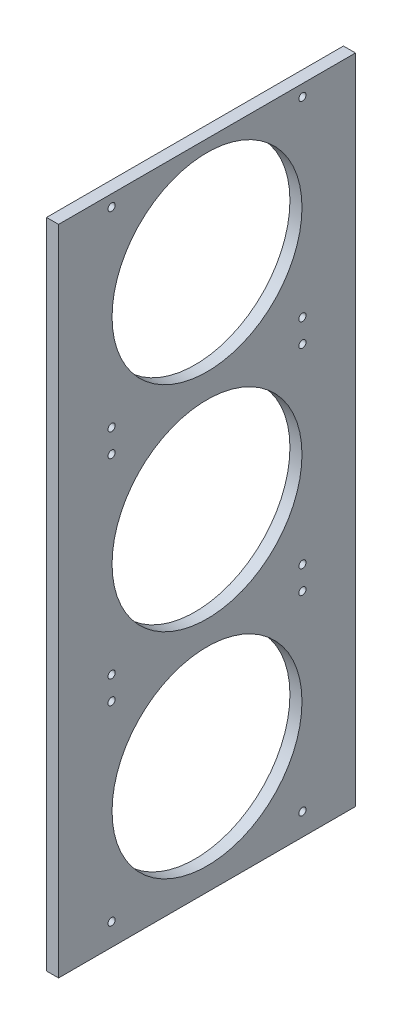
ISO-10303-21;
HEADER;
FILE_DESCRIPTION(('STEP AP214'),'2;1');
FILE_NAME('part.step','',(''),(''),'','','');
FILE_SCHEMA(('AUTOMOTIVE_DESIGN { 1 0 10303 214 1 1 1 1 }'));
ENDSEC;
DATA;
#1=APPLICATION_CONTEXT('core data for automotive mechanical design processes');
#2=APPLICATION_PROTOCOL_DEFINITION('international standard','automotive_design',2000,#1);
#3=PRODUCT_CONTEXT('',#1,'mechanical');
#4=PRODUCT('Part','Part','',(#3));
#5=PRODUCT_RELATED_PRODUCT_CATEGORY('part','',(#4));
#6=PRODUCT_DEFINITION_FORMATION('','',#4);
#7=PRODUCT_DEFINITION_CONTEXT('part definition',#1,'design');
#8=PRODUCT_DEFINITION('design','',#6,#7);
#9=PRODUCT_DEFINITION_SHAPE('','',#8);
#10=(LENGTH_UNIT() NAMED_UNIT(*) SI_UNIT(.MILLI.,.METRE.));
#11=(NAMED_UNIT(*) PLANE_ANGLE_UNIT() SI_UNIT($,.RADIAN.));
#12=(NAMED_UNIT(*) SI_UNIT($,.STERADIAN.) SOLID_ANGLE_UNIT());
#13=UNCERTAINTY_MEASURE_WITH_UNIT(LENGTH_MEASURE(1.E-05),#10,'distance_accuracy_value','');
#14=(GEOMETRIC_REPRESENTATION_CONTEXT(3) GLOBAL_UNCERTAINTY_ASSIGNED_CONTEXT((#13)) GLOBAL_UNIT_ASSIGNED_CONTEXT((#10,
#11,#12)) REPRESENTATION_CONTEXT('',''));
#15=CARTESIAN_POINT('',(0.,0.,0.));
#16=DIRECTION('',(0.,0.,1.));
#17=DIRECTION('',(1.,0.,0.));
#18=AXIS2_PLACEMENT_3D('',#15,#16,#17);
#19=CARTESIAN_POINT('',(-83.25,91.5,-55.5));
#20=DIRECTION('',(0.,0.,1.));
#21=DIRECTION('',(1.,0.,0.));
#22=AXIS2_PLACEMENT_3D('',#19,#20,#21);
#23=PLANE('',#22);
#24=DIRECTION('',(0.,1.,0.));
#25=VECTOR('',#24,1.);
#26=CARTESIAN_POINT('',(78.75,0.,-55.5));
#27=LINE('',#26,#25);
#28=CARTESIAN_POINT('',(78.75,0.,-55.5));
#29=VERTEX_POINT('',#28);
#30=CARTESIAN_POINT('',(78.75,244.,-55.5));
#31=VERTEX_POINT('',#30);
#32=EDGE_CURVE('E87',#29,#31,#27,.T.);
#33=ORIENTED_EDGE('',*,*,#32,.T.);
#34=DIRECTION('',(-1.,0.,0.));
#35=VECTOR('',#34,1.);
#36=CARTESIAN_POINT('',(-83.25,244.,-55.5));
#37=LINE('',#36,#35);
#38=CARTESIAN_POINT('',(83.25,244.,-55.5));
#39=VERTEX_POINT('',#38);
#40=EDGE_CURVE('E111',#39,#31,#37,.T.);
#41=ORIENTED_EDGE('',*,*,#40,.F.);
#42=DIRECTION('',(0.,-1.,0.));
#43=VECTOR('',#42,1.);
#44=CARTESIAN_POINT('',(83.25,91.5,-55.5));
#45=LINE('',#44,#43);
#46=CARTESIAN_POINT('',(83.25,0.,-55.5));
#47=VERTEX_POINT('',#46);
#48=EDGE_CURVE('E11',#39,#47,#45,.T.);
#49=ORIENTED_EDGE('',*,*,#48,.T.);
#50=DIRECTION('',(-1.,0.,0.));
#51=VECTOR('',#50,1.);
#52=CARTESIAN_POINT('',(-83.25,0.,-55.5));
#53=LINE('',#52,#51);
#54=EDGE_CURVE('E103',#47,#29,#53,.T.);
#55=ORIENTED_EDGE('',*,*,#54,.T.);
#56=EDGE_LOOP('',(#33,#41,#49,#55));
#57=FACE_BOUND('',#56,.T.);
#58=ADVANCED_FACE('F40',(#57),#23,.F.);
#59=CARTESIAN_POINT('',(-83.25,91.5,55.5));
#60=DIRECTION('',(0.,0.,-1.));
#61=DIRECTION('',(-1.,0.,0.));
#62=AXIS2_PLACEMENT_3D('',#59,#60,#61);
#63=PLANE('',#62);
#64=DIRECTION('',(0.,-1.,0.));
#65=VECTOR('',#64,1.);
#66=CARTESIAN_POINT('',(78.75,0.,55.5));
#67=LINE('',#66,#65);
#68=CARTESIAN_POINT('',(78.75,244.,55.5));
#69=VERTEX_POINT('',#68);
#70=CARTESIAN_POINT('',(78.75,0.,55.5));
#71=VERTEX_POINT('',#70);
#72=EDGE_CURVE('E85',#69,#71,#67,.T.);
#73=ORIENTED_EDGE('',*,*,#72,.T.);
#74=DIRECTION('',(1.,0.,0.));
#75=VECTOR('',#74,1.);
#76=CARTESIAN_POINT('',(-83.25,0.,55.5));
#77=LINE('',#76,#75);
#78=CARTESIAN_POINT('',(83.25,0.,55.5));
#79=VERTEX_POINT('',#78);
#80=EDGE_CURVE('E97',#71,#79,#77,.T.);
#81=ORIENTED_EDGE('',*,*,#80,.T.);
#82=DIRECTION('',(0.,-1.,0.));
#83=VECTOR('',#82,1.);
#84=CARTESIAN_POINT('',(83.25,91.5,55.5));
#85=LINE('',#84,#83);
#86=CARTESIAN_POINT('',(83.25,244.,55.5));
#87=VERTEX_POINT('',#86);
#88=EDGE_CURVE('E48',#87,#79,#85,.T.);
#89=ORIENTED_EDGE('',*,*,#88,.F.);
#90=DIRECTION('',(1.,0.,0.));
#91=VECTOR('',#90,1.);
#92=CARTESIAN_POINT('',(-83.25,244.,55.5));
#93=LINE('',#92,#91);
#94=EDGE_CURVE('E55',#69,#87,#93,.T.);
#95=ORIENTED_EDGE('',*,*,#94,.F.);
#96=EDGE_LOOP('',(#73,#81,#89,#95));
#97=FACE_BOUND('',#96,.T.);
#98=ADVANCED_FACE('F96',(#97),#63,.F.);
#99=CARTESIAN_POINT('',(0.,244.,0.));
#100=DIRECTION('',(0.,1.,0.));
#101=DIRECTION('',(0.,0.,1.));
#102=AXIS2_PLACEMENT_3D('',#99,#100,#101);
#103=PLANE('',#102);
#104=ORIENTED_EDGE('',*,*,#40,.T.);
#105=DIRECTION('',(0.,0.,-1.));
#106=VECTOR('',#105,1.);
#107=CARTESIAN_POINT('',(78.75,244.,-55.5));
#108=LINE('',#107,#106);
#109=EDGE_CURVE('E102',#69,#31,#108,.T.);
#110=ORIENTED_EDGE('',*,*,#109,.F.);
#111=ORIENTED_EDGE('',*,*,#94,.T.);
#112=DIRECTION('',(0.,0.,-1.));
#113=VECTOR('',#112,1.);
#114=CARTESIAN_POINT('',(83.25,244.,-55.5));
#115=LINE('',#114,#113);
#116=EDGE_CURVE('E105',#87,#39,#115,.T.);
#117=ORIENTED_EDGE('',*,*,#116,.T.);
#118=EDGE_LOOP('',(#104,#110,#111,#117));
#119=FACE_BOUND('',#118,.T.);
#120=ADVANCED_FACE('F115',(#119),#103,.T.);
#121=CARTESIAN_POINT('',(0.,0.,0.));
#122=DIRECTION('',(0.,1.,0.));
#123=DIRECTION('',(0.,0.,1.));
#124=AXIS2_PLACEMENT_3D('',#121,#122,#123);
#125=PLANE('',#124);
#126=DIRECTION('',(0.,0.,1.));
#127=VECTOR('',#126,1.);
#128=CARTESIAN_POINT('',(78.75,0.,-46.));
#129=LINE('',#128,#127);
#130=EDGE_CURVE('E81',#29,#71,#129,.T.);
#131=ORIENTED_EDGE('',*,*,#130,.F.);
#132=ORIENTED_EDGE('',*,*,#54,.F.);
#133=DIRECTION('',(0.,0.,-1.));
#134=VECTOR('',#133,1.);
#135=CARTESIAN_POINT('',(83.25,0.,-55.5));
#136=LINE('',#135,#134);
#137=EDGE_CURVE('E92',#79,#47,#136,.T.);
#138=ORIENTED_EDGE('',*,*,#137,.F.);
#139=ORIENTED_EDGE('',*,*,#80,.F.);
#140=EDGE_LOOP('',(#131,#132,#138,#139));
#141=FACE_BOUND('',#140,.T.);
#142=ADVANCED_FACE('F101',(#141),#125,.F.);
#143=CARTESIAN_POINT('',(83.25,91.5,-55.5));
#144=DIRECTION('',(-1.,0.,0.));
#145=DIRECTION('',(0.,0.,1.));
#146=AXIS2_PLACEMENT_3D('',#143,#144,#145);
#147=PLANE('',#146);
#148=CARTESIAN_POINT('',(83.25,79.675,-35.675));
#149=DIRECTION('',(1.,0.,0.));
#150=DIRECTION('',(0.,0.,-1.));
#151=AXIS2_PLACEMENT_3D('',#148,#149,#150);
#152=CIRCLE('',#151,1.35254999999999);
#153=CARTESIAN_POINT('',(83.25,79.675,-37.02755));
#154=VERTEX_POINT('',#153);
#155=EDGE_CURVE('E131',#154,#154,#152,.T.);
#156=ORIENTED_EDGE('',*,*,#155,.F.);
#157=EDGE_LOOP('',(#156));
#158=FACE_BOUND('',#157,.T.);
#159=CARTESIAN_POINT('',(83.25,88.325,35.675));
#160=DIRECTION('',(1.,0.,0.));
#161=DIRECTION('',(0.,0.,-1.));
#162=AXIS2_PLACEMENT_3D('',#159,#160,#161);
#163=CIRCLE('',#162,1.35254999999999);
#164=CARTESIAN_POINT('',(83.25,88.325,34.32245));
#165=VERTEX_POINT('',#164);
#166=EDGE_CURVE('E143',#165,#165,#163,.T.);
#167=ORIENTED_EDGE('',*,*,#166,.F.);
#168=EDGE_LOOP('',(#167));
#169=FACE_BOUND('',#168,.T.);
#170=CARTESIAN_POINT('',(83.25,159.675,-35.675));
#171=DIRECTION('',(1.,0.,0.));
#172=DIRECTION('',(0.,0.,-1.));
#173=AXIS2_PLACEMENT_3D('',#170,#171,#172);
#174=CIRCLE('',#173,1.35255000000001);
#175=CARTESIAN_POINT('',(83.25,159.675,-37.02755));
#176=VERTEX_POINT('',#175);
#177=EDGE_CURVE('E155',#176,#176,#174,.T.);
#178=ORIENTED_EDGE('',*,*,#177,.F.);
#179=EDGE_LOOP('',(#178));
#180=FACE_BOUND('',#179,.T.);
#181=CARTESIAN_POINT('',(83.25,239.675,-35.675));
#182=DIRECTION('',(1.,0.,0.));
#183=DIRECTION('',(0.,0.,-1.));
#184=AXIS2_PLACEMENT_3D('',#181,#182,#183);
#185=CIRCLE('',#184,1.35255000000001);
#186=CARTESIAN_POINT('',(83.25,239.675,-37.02755));
#187=VERTEX_POINT('',#186);
#188=EDGE_CURVE('E173',#187,#187,#185,.T.);
#189=ORIENTED_EDGE('',*,*,#188,.F.);
#190=EDGE_LOOP('',(#189));
#191=FACE_BOUND('',#190,.T.);
#192=CARTESIAN_POINT('',(83.25,168.325,-35.675));
#193=DIRECTION('',(1.,0.,0.));
#194=DIRECTION('',(0.,0.,-1.));
#195=AXIS2_PLACEMENT_3D('',#192,#193,#194);
#196=CIRCLE('',#195,1.35255000000001);
#197=CARTESIAN_POINT('',(83.25,168.325,-37.02755));
#198=VERTEX_POINT('',#197);
#199=EDGE_CURVE('E179',#198,#198,#196,.T.);
#200=ORIENTED_EDGE('',*,*,#199,.F.);
#201=EDGE_LOOP('',(#200));
#202=FACE_BOUND('',#201,.T.);
#203=CARTESIAN_POINT('',(83.25,168.325,35.675));
#204=DIRECTION('',(1.,0.,0.));
#205=DIRECTION('',(0.,0.,-1.));
#206=AXIS2_PLACEMENT_3D('',#203,#204,#205);
#207=CIRCLE('',#206,1.35255000000001);
#208=CARTESIAN_POINT('',(83.25,168.325,34.32245));
#209=VERTEX_POINT('',#208);
#210=EDGE_CURVE('E185',#209,#209,#207,.T.);
#211=ORIENTED_EDGE('',*,*,#210,.F.);
#212=EDGE_LOOP('',(#211));
#213=FACE_BOUND('',#212,.T.);
#214=CARTESIAN_POINT('',(83.25,204.,0.));
#215=DIRECTION('',(1.,0.,0.));
#216=DIRECTION('',(0.,0.,-1.));
#217=AXIS2_PLACEMENT_3D('',#214,#215,#216);
#218=CIRCLE('',#217,35.5);
#219=CARTESIAN_POINT('',(83.25,204.,-35.5));
#220=VERTEX_POINT('',#219);
#221=EDGE_CURVE('E93',#220,#220,#218,.T.);
#222=ORIENTED_EDGE('',*,*,#221,.F.);
#223=EDGE_LOOP('',(#222));
#224=FACE_BOUND('',#223,.T.);
#225=CARTESIAN_POINT('',(83.25,124.,0.));
#226=DIRECTION('',(1.,0.,0.));
#227=DIRECTION('',(0.,0.,-1.));
#228=AXIS2_PLACEMENT_3D('',#225,#226,#227);
#229=CIRCLE('',#228,35.5);
#230=CARTESIAN_POINT('',(83.25,124.,-35.5));
#231=VERTEX_POINT('',#230);
#232=EDGE_CURVE('E197',#231,#231,#229,.T.);
#233=ORIENTED_EDGE('',*,*,#232,.F.);
#234=EDGE_LOOP('',(#233));
#235=FACE_BOUND('',#234,.T.);
#236=CARTESIAN_POINT('',(83.25,44.,0.));
#237=DIRECTION('',(1.,0.,0.));
#238=DIRECTION('',(0.,0.,-1.));
#239=AXIS2_PLACEMENT_3D('',#236,#237,#238);
#240=CIRCLE('',#239,35.5);
#241=CARTESIAN_POINT('',(83.25,44.,-35.5000000000001));
#242=VERTEX_POINT('',#241);
#243=EDGE_CURVE('E203',#242,#242,#240,.T.);
#244=ORIENTED_EDGE('',*,*,#243,.F.);
#245=EDGE_LOOP('',(#244));
#246=FACE_BOUND('',#245,.T.);
#247=ORIENTED_EDGE('',*,*,#88,.T.);
#248=ORIENTED_EDGE('',*,*,#137,.T.);
#249=ORIENTED_EDGE('',*,*,#48,.F.);
#250=ORIENTED_EDGE('',*,*,#116,.F.);
#251=EDGE_LOOP('',(#247,#248,#249,#250));
#252=FACE_BOUND('',#251,.T.);
#253=CARTESIAN_POINT('',(83.25,239.675,35.675));
#254=DIRECTION('',(1.,0.,0.));
#255=DIRECTION('',(0.,0.,-1.));
#256=AXIS2_PLACEMENT_3D('',#253,#254,#255);
#257=CIRCLE('',#256,1.35255000000001);
#258=CARTESIAN_POINT('',(83.25,239.675,34.32245));
#259=VERTEX_POINT('',#258);
#260=EDGE_CURVE('E167',#259,#259,#257,.T.);
#261=ORIENTED_EDGE('',*,*,#260,.F.);
#262=EDGE_LOOP('',(#261));
#263=FACE_BOUND('',#262,.T.);
#264=CARTESIAN_POINT('',(83.25,159.675,35.675));
#265=DIRECTION('',(1.,0.,0.));
#266=DIRECTION('',(0.,0.,-1.));
#267=AXIS2_PLACEMENT_3D('',#264,#265,#266);
#268=CIRCLE('',#267,1.35255000000001);
#269=CARTESIAN_POINT('',(83.25,159.675,34.32245));
#270=VERTEX_POINT('',#269);
#271=EDGE_CURVE('E161',#270,#270,#268,.T.);
#272=ORIENTED_EDGE('',*,*,#271,.F.);
#273=EDGE_LOOP('',(#272));
#274=FACE_BOUND('',#273,.T.);
#275=CARTESIAN_POINT('',(83.25,88.325,-35.675));
#276=DIRECTION('',(1.,0.,0.));
#277=DIRECTION('',(0.,0.,-1.));
#278=AXIS2_PLACEMENT_3D('',#275,#276,#277);
#279=CIRCLE('',#278,1.35254999999999);
#280=CARTESIAN_POINT('',(83.25,88.325,-37.02755));
#281=VERTEX_POINT('',#280);
#282=EDGE_CURVE('E149',#281,#281,#279,.T.);
#283=ORIENTED_EDGE('',*,*,#282,.F.);
#284=EDGE_LOOP('',(#283));
#285=FACE_BOUND('',#284,.T.);
#286=CARTESIAN_POINT('',(83.25,79.675,35.675));
#287=DIRECTION('',(1.,0.,0.));
#288=DIRECTION('',(0.,0.,-1.));
#289=AXIS2_PLACEMENT_3D('',#286,#287,#288);
#290=CIRCLE('',#289,1.35254999999999);
#291=CARTESIAN_POINT('',(83.25,79.675,34.32245));
#292=VERTEX_POINT('',#291);
#293=EDGE_CURVE('E137',#292,#292,#290,.T.);
#294=ORIENTED_EDGE('',*,*,#293,.F.);
#295=EDGE_LOOP('',(#294));
#296=FACE_BOUND('',#295,.T.);
#297=CARTESIAN_POINT('',(83.25,8.325,-35.675));
#298=DIRECTION('',(1.,0.,0.));
#299=DIRECTION('',(0.,0.,-1.));
#300=AXIS2_PLACEMENT_3D('',#297,#298,#299);
#301=CIRCLE('',#300,1.35255);
#302=CARTESIAN_POINT('',(83.25,8.325,-37.02755));
#303=VERTEX_POINT('',#302);
#304=EDGE_CURVE('E125',#303,#303,#301,.T.);
#305=ORIENTED_EDGE('',*,*,#304,.F.);
#306=EDGE_LOOP('',(#305));
#307=FACE_BOUND('',#306,.T.);
#308=CARTESIAN_POINT('',(83.25,8.325,35.675));
#309=DIRECTION('',(1.,0.,0.));
#310=DIRECTION('',(0.,0.,-1.));
#311=AXIS2_PLACEMENT_3D('',#308,#309,#310);
#312=CIRCLE('',#311,1.35255);
#313=CARTESIAN_POINT('',(83.25,8.325,34.32245));
#314=VERTEX_POINT('',#313);
#315=EDGE_CURVE('E117',#314,#314,#312,.T.);
#316=ORIENTED_EDGE('',*,*,#315,.F.);
#317=EDGE_LOOP('',(#316));
#318=FACE_BOUND('',#317,.T.);
#319=ADVANCED_FACE('F42',(#158,#169,#180,#191,#202,#213,#224,#235,#246,#252,#263,#274,#285,#296,
#307,#318),#147,.F.);
#320=CARTESIAN_POINT('',(78.75,91.5,-55.5));
#321=DIRECTION('',(-1.,0.,0.));
#322=DIRECTION('',(0.,0.,1.));
#323=AXIS2_PLACEMENT_3D('',#320,#321,#322);
#324=PLANE('',#323);
#325=ORIENTED_EDGE('',*,*,#109,.T.);
#326=ORIENTED_EDGE('',*,*,#32,.F.);
#327=ORIENTED_EDGE('',*,*,#130,.T.);
#328=ORIENTED_EDGE('',*,*,#72,.F.);
#329=EDGE_LOOP('',(#325,#326,#327,#328));
#330=FACE_BOUND('',#329,.T.);
#331=CARTESIAN_POINT('',(78.75,8.325,35.675));
#332=DIRECTION('',(-1.,0.,0.));
#333=DIRECTION('',(0.,0.,1.));
#334=AXIS2_PLACEMENT_3D('',#331,#332,#333);
#335=CIRCLE('',#334,1.35255);
#336=CARTESIAN_POINT('',(78.75,8.325,37.02755));
#337=VERTEX_POINT('',#336);
#338=EDGE_CURVE('E120',#337,#337,#335,.T.);
#339=ORIENTED_EDGE('',*,*,#338,.F.);
#340=EDGE_LOOP('',(#339));
#341=FACE_BOUND('',#340,.T.);
#342=CARTESIAN_POINT('',(78.75,8.325,-35.675));
#343=DIRECTION('',(-1.,0.,0.));
#344=DIRECTION('',(0.,0.,1.));
#345=AXIS2_PLACEMENT_3D('',#342,#343,#344);
#346=CIRCLE('',#345,1.35255);
#347=CARTESIAN_POINT('',(78.75,8.325,-34.32245));
#348=VERTEX_POINT('',#347);
#349=EDGE_CURVE('E128',#348,#348,#346,.T.);
#350=ORIENTED_EDGE('',*,*,#349,.F.);
#351=EDGE_LOOP('',(#350));
#352=FACE_BOUND('',#351,.T.);
#353=CARTESIAN_POINT('',(78.75,79.675,-35.675));
#354=DIRECTION('',(-1.,0.,0.));
#355=DIRECTION('',(0.,0.,1.));
#356=AXIS2_PLACEMENT_3D('',#353,#354,#355);
#357=CIRCLE('',#356,1.35254999999999);
#358=CARTESIAN_POINT('',(78.75,79.675,-34.32245));
#359=VERTEX_POINT('',#358);
#360=EDGE_CURVE('E134',#359,#359,#357,.T.);
#361=ORIENTED_EDGE('',*,*,#360,.F.);
#362=EDGE_LOOP('',(#361));
#363=FACE_BOUND('',#362,.T.);
#364=CARTESIAN_POINT('',(78.75,79.675,35.675));
#365=DIRECTION('',(-1.,0.,0.));
#366=DIRECTION('',(0.,0.,1.));
#367=AXIS2_PLACEMENT_3D('',#364,#365,#366);
#368=CIRCLE('',#367,1.35254999999999);
#369=CARTESIAN_POINT('',(78.75,79.675,37.02755));
#370=VERTEX_POINT('',#369);
#371=EDGE_CURVE('E140',#370,#370,#368,.T.);
#372=ORIENTED_EDGE('',*,*,#371,.F.);
#373=EDGE_LOOP('',(#372));
#374=FACE_BOUND('',#373,.T.);
#375=CARTESIAN_POINT('',(78.75,88.325,35.675));
#376=DIRECTION('',(-1.,0.,0.));
#377=DIRECTION('',(0.,0.,1.));
#378=AXIS2_PLACEMENT_3D('',#375,#376,#377);
#379=CIRCLE('',#378,1.35254999999999);
#380=CARTESIAN_POINT('',(78.75,88.325,37.02755));
#381=VERTEX_POINT('',#380);
#382=EDGE_CURVE('E146',#381,#381,#379,.T.);
#383=ORIENTED_EDGE('',*,*,#382,.F.);
#384=EDGE_LOOP('',(#383));
#385=FACE_BOUND('',#384,.T.);
#386=CARTESIAN_POINT('',(78.75,88.325,-35.675));
#387=DIRECTION('',(-1.,0.,0.));
#388=DIRECTION('',(0.,0.,1.));
#389=AXIS2_PLACEMENT_3D('',#386,#387,#388);
#390=CIRCLE('',#389,1.35254999999999);
#391=CARTESIAN_POINT('',(78.75,88.325,-34.32245));
#392=VERTEX_POINT('',#391);
#393=EDGE_CURVE('E152',#392,#392,#390,.T.);
#394=ORIENTED_EDGE('',*,*,#393,.F.);
#395=EDGE_LOOP('',(#394));
#396=FACE_BOUND('',#395,.T.);
#397=CARTESIAN_POINT('',(78.75,159.675,-35.675));
#398=DIRECTION('',(-1.,0.,0.));
#399=DIRECTION('',(0.,0.,1.));
#400=AXIS2_PLACEMENT_3D('',#397,#398,#399);
#401=CIRCLE('',#400,1.35255000000001);
#402=CARTESIAN_POINT('',(78.75,159.675,-34.32245));
#403=VERTEX_POINT('',#402);
#404=EDGE_CURVE('E158',#403,#403,#401,.T.);
#405=ORIENTED_EDGE('',*,*,#404,.F.);
#406=EDGE_LOOP('',(#405));
#407=FACE_BOUND('',#406,.T.);
#408=CARTESIAN_POINT('',(78.75,159.675,35.675));
#409=DIRECTION('',(-1.,0.,0.));
#410=DIRECTION('',(0.,0.,1.));
#411=AXIS2_PLACEMENT_3D('',#408,#409,#410);
#412=CIRCLE('',#411,1.35255000000001);
#413=CARTESIAN_POINT('',(78.75,159.675,37.02755));
#414=VERTEX_POINT('',#413);
#415=EDGE_CURVE('E164',#414,#414,#412,.T.);
#416=ORIENTED_EDGE('',*,*,#415,.F.);
#417=EDGE_LOOP('',(#416));
#418=FACE_BOUND('',#417,.T.);
#419=CARTESIAN_POINT('',(78.75,239.675,35.675));
#420=DIRECTION('',(-1.,0.,0.));
#421=DIRECTION('',(0.,0.,1.));
#422=AXIS2_PLACEMENT_3D('',#419,#420,#421);
#423=CIRCLE('',#422,1.35255000000001);
#424=CARTESIAN_POINT('',(78.75,239.675,37.02755));
#425=VERTEX_POINT('',#424);
#426=EDGE_CURVE('E170',#425,#425,#423,.T.);
#427=ORIENTED_EDGE('',*,*,#426,.F.);
#428=EDGE_LOOP('',(#427));
#429=FACE_BOUND('',#428,.T.);
#430=CARTESIAN_POINT('',(78.75,239.675,-35.675));
#431=DIRECTION('',(-1.,0.,0.));
#432=DIRECTION('',(0.,0.,1.));
#433=AXIS2_PLACEMENT_3D('',#430,#431,#432);
#434=CIRCLE('',#433,1.35255000000001);
#435=CARTESIAN_POINT('',(78.75,239.675,-34.32245));
#436=VERTEX_POINT('',#435);
#437=EDGE_CURVE('E176',#436,#436,#434,.T.);
#438=ORIENTED_EDGE('',*,*,#437,.F.);
#439=EDGE_LOOP('',(#438));
#440=FACE_BOUND('',#439,.T.);
#441=CARTESIAN_POINT('',(78.75,168.325,-35.675));
#442=DIRECTION('',(-1.,0.,0.));
#443=DIRECTION('',(0.,0.,1.));
#444=AXIS2_PLACEMENT_3D('',#441,#442,#443);
#445=CIRCLE('',#444,1.35255000000001);
#446=CARTESIAN_POINT('',(78.75,168.325,-34.32245));
#447=VERTEX_POINT('',#446);
#448=EDGE_CURVE('E182',#447,#447,#445,.T.);
#449=ORIENTED_EDGE('',*,*,#448,.F.);
#450=EDGE_LOOP('',(#449));
#451=FACE_BOUND('',#450,.T.);
#452=CARTESIAN_POINT('',(78.75,168.325,35.675));
#453=DIRECTION('',(-1.,0.,0.));
#454=DIRECTION('',(0.,0.,1.));
#455=AXIS2_PLACEMENT_3D('',#452,#453,#454);
#456=CIRCLE('',#455,1.35255000000001);
#457=CARTESIAN_POINT('',(78.75,168.325,37.02755));
#458=VERTEX_POINT('',#457);
#459=EDGE_CURVE('E188',#458,#458,#456,.T.);
#460=ORIENTED_EDGE('',*,*,#459,.F.);
#461=EDGE_LOOP('',(#460));
#462=FACE_BOUND('',#461,.T.);
#463=CARTESIAN_POINT('',(78.75,204.,0.));
#464=DIRECTION('',(-1.,0.,0.));
#465=DIRECTION('',(0.,0.,1.));
#466=AXIS2_PLACEMENT_3D('',#463,#464,#465);
#467=CIRCLE('',#466,35.5);
#468=CARTESIAN_POINT('',(78.75,204.,35.5));
#469=VERTEX_POINT('',#468);
#470=EDGE_CURVE('E194',#469,#469,#467,.F.);
#471=ORIENTED_EDGE('',*,*,#470,.T.);
#472=EDGE_LOOP('',(#471));
#473=FACE_BOUND('',#472,.T.);
#474=CARTESIAN_POINT('',(78.75,124.,0.));
#475=DIRECTION('',(-1.,0.,0.));
#476=DIRECTION('',(0.,0.,1.));
#477=AXIS2_PLACEMENT_3D('',#474,#475,#476);
#478=CIRCLE('',#477,35.5);
#479=CARTESIAN_POINT('',(78.75,124.,35.5));
#480=VERTEX_POINT('',#479);
#481=EDGE_CURVE('E200',#480,#480,#478,.F.);
#482=ORIENTED_EDGE('',*,*,#481,.T.);
#483=EDGE_LOOP('',(#482));
#484=FACE_BOUND('',#483,.T.);
#485=CARTESIAN_POINT('',(78.75,44.,0.));
#486=DIRECTION('',(-1.,0.,0.));
#487=DIRECTION('',(0.,0.,1.));
#488=AXIS2_PLACEMENT_3D('',#485,#486,#487);
#489=CIRCLE('',#488,35.5);
#490=CARTESIAN_POINT('',(78.75,44.,35.5));
#491=VERTEX_POINT('',#490);
#492=EDGE_CURVE('E191',#491,#491,#489,.F.);
#493=ORIENTED_EDGE('',*,*,#492,.T.);
#494=EDGE_LOOP('',(#493));
#495=FACE_BOUND('',#494,.T.);
#496=ADVANCED_FACE('F83',(#330,#341,#352,#363,#374,#385,#396,#407,#418,#429,#440,#451,#462,#473,
#484,#495),#324,.T.);
#497=CARTESIAN_POINT('',(-83.251,44.,0.));
#498=DIRECTION('',(1.,0.,0.));
#499=DIRECTION('',(0.,0.,-1.));
#500=AXIS2_PLACEMENT_3D('',#497,#498,#499);
#501=CYLINDRICAL_SURFACE('',#500,35.5);
#502=ORIENTED_EDGE('',*,*,#492,.F.);
#503=EDGE_LOOP('',(#502));
#504=FACE_BOUND('',#503,.T.);
#505=ORIENTED_EDGE('',*,*,#243,.T.);
#506=EDGE_LOOP('',(#505));
#507=FACE_BOUND('',#506,.T.);
#508=ADVANCED_FACE('F210',(#504,#507),#501,.F.);
#509=CARTESIAN_POINT('',(-83.251,124.,0.));
#510=DIRECTION('',(1.,0.,0.));
#511=DIRECTION('',(0.,0.,-1.));
#512=AXIS2_PLACEMENT_3D('',#509,#510,#511);
#513=CYLINDRICAL_SURFACE('',#512,35.5);
#514=ORIENTED_EDGE('',*,*,#481,.F.);
#515=EDGE_LOOP('',(#514));
#516=FACE_BOUND('',#515,.T.);
#517=ORIENTED_EDGE('',*,*,#232,.T.);
#518=EDGE_LOOP('',(#517));
#519=FACE_BOUND('',#518,.T.);
#520=ADVANCED_FACE('F213',(#516,#519),#513,.F.);
#521=CARTESIAN_POINT('',(-83.251,204.,0.));
#522=DIRECTION('',(1.,0.,0.));
#523=DIRECTION('',(0.,0.,-1.));
#524=AXIS2_PLACEMENT_3D('',#521,#522,#523);
#525=CYLINDRICAL_SURFACE('',#524,35.5);
#526=ORIENTED_EDGE('',*,*,#470,.F.);
#527=EDGE_LOOP('',(#526));
#528=FACE_BOUND('',#527,.T.);
#529=ORIENTED_EDGE('',*,*,#221,.T.);
#530=EDGE_LOOP('',(#529));
#531=FACE_BOUND('',#530,.T.);
#532=ADVANCED_FACE('F238',(#528,#531),#525,.F.);
#533=CARTESIAN_POINT('',(83.25,168.325,35.675));
#534=DIRECTION('',(1.,0.,0.));
#535=DIRECTION('',(0.,0.,-1.));
#536=AXIS2_PLACEMENT_3D('',#533,#534,#535);
#537=CYLINDRICAL_SURFACE('',#536,1.35255000000001);
#538=ORIENTED_EDGE('',*,*,#210,.T.);
#539=EDGE_LOOP('',(#538));
#540=FACE_BOUND('',#539,.T.);
#541=ORIENTED_EDGE('',*,*,#459,.T.);
#542=EDGE_LOOP('',(#541));
#543=FACE_BOUND('',#542,.T.);
#544=ADVANCED_FACE('F242',(#540,#543),#537,.F.);
#545=CARTESIAN_POINT('',(83.25,168.325,-35.675));
#546=DIRECTION('',(1.,0.,0.));
#547=DIRECTION('',(0.,0.,-1.));
#548=AXIS2_PLACEMENT_3D('',#545,#546,#547);
#549=CYLINDRICAL_SURFACE('',#548,1.35255000000001);
#550=ORIENTED_EDGE('',*,*,#199,.T.);
#551=EDGE_LOOP('',(#550));
#552=FACE_BOUND('',#551,.T.);
#553=ORIENTED_EDGE('',*,*,#448,.T.);
#554=EDGE_LOOP('',(#553));
#555=FACE_BOUND('',#554,.T.);
#556=ADVANCED_FACE('F246',(#552,#555),#549,.F.);
#557=CARTESIAN_POINT('',(83.25,239.675,-35.675));
#558=DIRECTION('',(1.,0.,0.));
#559=DIRECTION('',(0.,0.,-1.));
#560=AXIS2_PLACEMENT_3D('',#557,#558,#559);
#561=CYLINDRICAL_SURFACE('',#560,1.35255000000001);
#562=ORIENTED_EDGE('',*,*,#188,.T.);
#563=EDGE_LOOP('',(#562));
#564=FACE_BOUND('',#563,.T.);
#565=ORIENTED_EDGE('',*,*,#437,.T.);
#566=EDGE_LOOP('',(#565));
#567=FACE_BOUND('',#566,.T.);
#568=ADVANCED_FACE('F250',(#564,#567),#561,.F.);
#569=CARTESIAN_POINT('',(83.25,239.675,35.675));
#570=DIRECTION('',(1.,0.,0.));
#571=DIRECTION('',(0.,0.,-1.));
#572=AXIS2_PLACEMENT_3D('',#569,#570,#571);
#573=CYLINDRICAL_SURFACE('',#572,1.35255000000001);
#574=ORIENTED_EDGE('',*,*,#260,.T.);
#575=EDGE_LOOP('',(#574));
#576=FACE_BOUND('',#575,.T.);
#577=ORIENTED_EDGE('',*,*,#426,.T.);
#578=EDGE_LOOP('',(#577));
#579=FACE_BOUND('',#578,.T.);
#580=ADVANCED_FACE('F254',(#576,#579),#573,.F.);
#581=CARTESIAN_POINT('',(83.25,159.675,35.675));
#582=DIRECTION('',(1.,0.,0.));
#583=DIRECTION('',(0.,0.,-1.));
#584=AXIS2_PLACEMENT_3D('',#581,#582,#583);
#585=CYLINDRICAL_SURFACE('',#584,1.35255000000001);
#586=ORIENTED_EDGE('',*,*,#271,.T.);
#587=EDGE_LOOP('',(#586));
#588=FACE_BOUND('',#587,.T.);
#589=ORIENTED_EDGE('',*,*,#415,.T.);
#590=EDGE_LOOP('',(#589));
#591=FACE_BOUND('',#590,.T.);
#592=ADVANCED_FACE('F258',(#588,#591),#585,.F.);
#593=CARTESIAN_POINT('',(83.25,159.675,-35.675));
#594=DIRECTION('',(1.,0.,0.));
#595=DIRECTION('',(0.,0.,-1.));
#596=AXIS2_PLACEMENT_3D('',#593,#594,#595);
#597=CYLINDRICAL_SURFACE('',#596,1.35255000000001);
#598=ORIENTED_EDGE('',*,*,#177,.T.);
#599=EDGE_LOOP('',(#598));
#600=FACE_BOUND('',#599,.T.);
#601=ORIENTED_EDGE('',*,*,#404,.T.);
#602=EDGE_LOOP('',(#601));
#603=FACE_BOUND('',#602,.T.);
#604=ADVANCED_FACE('F262',(#600,#603),#597,.F.);
#605=CARTESIAN_POINT('',(83.25,88.325,-35.675));
#606=DIRECTION('',(1.,0.,0.));
#607=DIRECTION('',(0.,0.,-1.));
#608=AXIS2_PLACEMENT_3D('',#605,#606,#607);
#609=CYLINDRICAL_SURFACE('',#608,1.35254999999999);
#610=ORIENTED_EDGE('',*,*,#282,.T.);
#611=EDGE_LOOP('',(#610));
#612=FACE_BOUND('',#611,.T.);
#613=ORIENTED_EDGE('',*,*,#393,.T.);
#614=EDGE_LOOP('',(#613));
#615=FACE_BOUND('',#614,.T.);
#616=ADVANCED_FACE('F266',(#612,#615),#609,.F.);
#617=CARTESIAN_POINT('',(83.25,88.325,35.675));
#618=DIRECTION('',(1.,0.,0.));
#619=DIRECTION('',(0.,0.,-1.));
#620=AXIS2_PLACEMENT_3D('',#617,#618,#619);
#621=CYLINDRICAL_SURFACE('',#620,1.35254999999999);
#622=ORIENTED_EDGE('',*,*,#166,.T.);
#623=EDGE_LOOP('',(#622));
#624=FACE_BOUND('',#623,.T.);
#625=ORIENTED_EDGE('',*,*,#382,.T.);
#626=EDGE_LOOP('',(#625));
#627=FACE_BOUND('',#626,.T.);
#628=ADVANCED_FACE('F270',(#624,#627),#621,.F.);
#629=CARTESIAN_POINT('',(83.25,79.675,35.675));
#630=DIRECTION('',(1.,0.,0.));
#631=DIRECTION('',(0.,0.,-1.));
#632=AXIS2_PLACEMENT_3D('',#629,#630,#631);
#633=CYLINDRICAL_SURFACE('',#632,1.35254999999999);
#634=ORIENTED_EDGE('',*,*,#293,.T.);
#635=EDGE_LOOP('',(#634));
#636=FACE_BOUND('',#635,.T.);
#637=ORIENTED_EDGE('',*,*,#371,.T.);
#638=EDGE_LOOP('',(#637));
#639=FACE_BOUND('',#638,.T.);
#640=ADVANCED_FACE('F274',(#636,#639),#633,.F.);
#641=CARTESIAN_POINT('',(83.25,79.675,-35.675));
#642=DIRECTION('',(1.,0.,0.));
#643=DIRECTION('',(0.,0.,-1.));
#644=AXIS2_PLACEMENT_3D('',#641,#642,#643);
#645=CYLINDRICAL_SURFACE('',#644,1.35254999999999);
#646=ORIENTED_EDGE('',*,*,#155,.T.);
#647=EDGE_LOOP('',(#646));
#648=FACE_BOUND('',#647,.T.);
#649=ORIENTED_EDGE('',*,*,#360,.T.);
#650=EDGE_LOOP('',(#649));
#651=FACE_BOUND('',#650,.T.);
#652=ADVANCED_FACE('F278',(#648,#651),#645,.F.);
#653=CARTESIAN_POINT('',(83.25,8.325,-35.675));
#654=DIRECTION('',(1.,0.,0.));
#655=DIRECTION('',(0.,0.,-1.));
#656=AXIS2_PLACEMENT_3D('',#653,#654,#655);
#657=CYLINDRICAL_SURFACE('',#656,1.35255);
#658=ORIENTED_EDGE('',*,*,#304,.T.);
#659=EDGE_LOOP('',(#658));
#660=FACE_BOUND('',#659,.T.);
#661=ORIENTED_EDGE('',*,*,#349,.T.);
#662=EDGE_LOOP('',(#661));
#663=FACE_BOUND('',#662,.T.);
#664=ADVANCED_FACE('F282',(#660,#663),#657,.F.);
#665=CARTESIAN_POINT('',(83.25,8.325,35.675));
#666=DIRECTION('',(1.,0.,0.));
#667=DIRECTION('',(0.,0.,-1.));
#668=AXIS2_PLACEMENT_3D('',#665,#666,#667);
#669=CYLINDRICAL_SURFACE('',#668,1.35255);
#670=ORIENTED_EDGE('',*,*,#315,.T.);
#671=EDGE_LOOP('',(#670));
#672=FACE_BOUND('',#671,.T.);
#673=ORIENTED_EDGE('',*,*,#338,.T.);
#674=EDGE_LOOP('',(#673));
#675=FACE_BOUND('',#674,.T.);
#676=ADVANCED_FACE('F286',(#672,#675),#669,.F.);
#677=CLOSED_SHELL('',(#58,#98,#120,#142,#319,#496,#508,#520,#532,#544,#556,#568,#580,#592,#604,
#616,#628,#640,#652,#664,#676));
#678=MANIFOLD_SOLID_BREP('B2',#677);
#679=ADVANCED_BREP_SHAPE_REPRESENTATION('',(#18,#678),#14);
#680=SHAPE_DEFINITION_REPRESENTATION(#9,#679);
ENDSEC;
END-ISO-10303-21;
